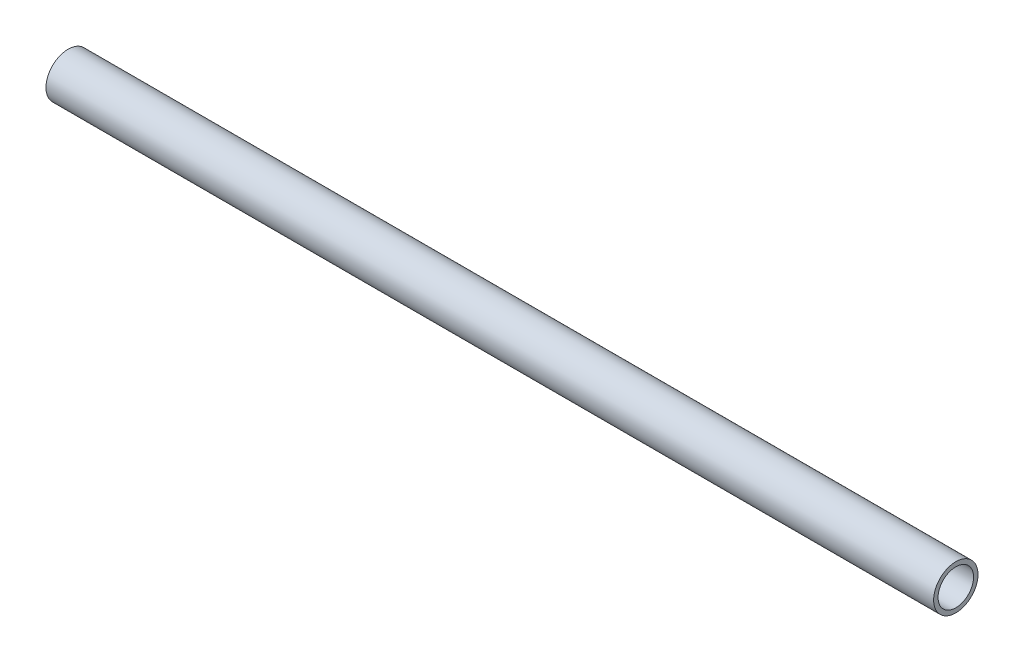
ISO-10303-21;
HEADER;
FILE_DESCRIPTION(('STEP AP214'),'2;1');
FILE_NAME('part.step','',(''),(''),'','','');
FILE_SCHEMA(('AUTOMOTIVE_DESIGN { 1 0 10303 214 1 1 1 1 }'));
ENDSEC;
DATA;
#1=APPLICATION_CONTEXT('core data for automotive mechanical design processes');
#2=APPLICATION_PROTOCOL_DEFINITION('international standard','automotive_design',2000,#1);
#3=PRODUCT_CONTEXT('',#1,'mechanical');
#4=PRODUCT('Part','Part','',(#3));
#5=PRODUCT_RELATED_PRODUCT_CATEGORY('part','',(#4));
#6=PRODUCT_DEFINITION_FORMATION('','',#4);
#7=PRODUCT_DEFINITION_CONTEXT('part definition',#1,'design');
#8=PRODUCT_DEFINITION('design','',#6,#7);
#9=PRODUCT_DEFINITION_SHAPE('','',#8);
#10=(LENGTH_UNIT() NAMED_UNIT(*) SI_UNIT(.MILLI.,.METRE.));
#11=(NAMED_UNIT(*) PLANE_ANGLE_UNIT() SI_UNIT($,.RADIAN.));
#12=(NAMED_UNIT(*) SI_UNIT($,.STERADIAN.) SOLID_ANGLE_UNIT());
#13=UNCERTAINTY_MEASURE_WITH_UNIT(LENGTH_MEASURE(1.E-05),#10,'distance_accuracy_value','');
#14=(GEOMETRIC_REPRESENTATION_CONTEXT(3) GLOBAL_UNCERTAINTY_ASSIGNED_CONTEXT((#13)) GLOBAL_UNIT_ASSIGNED_CONTEXT((#10,
#11,#12)) REPRESENTATION_CONTEXT('',''));
#15=CARTESIAN_POINT('',(0.,0.,0.));
#16=DIRECTION('',(0.,0.,1.));
#17=DIRECTION('',(1.,0.,0.));
#18=AXIS2_PLACEMENT_3D('',#15,#16,#17);
#19=CARTESIAN_POINT('',(100.,0.,0.));
#20=DIRECTION('',(1.,0.,0.));
#21=DIRECTION('',(0.,0.,-1.));
#22=AXIS2_PLACEMENT_3D('',#19,#20,#21);
#23=PLANE('',#22);
#24=CARTESIAN_POINT('',(100.,0.,0.));
#25=DIRECTION('',(1.,0.,0.));
#26=DIRECTION('',(0.,0.,-1.));
#27=AXIS2_PLACEMENT_3D('',#24,#25,#26);
#28=CIRCLE('',#27,5.);
#29=CARTESIAN_POINT('',(100.,0.,-5.));
#30=VERTEX_POINT('',#29);
#31=EDGE_CURVE('E10',#30,#30,#28,.T.);
#32=ORIENTED_EDGE('',*,*,#31,.T.);
#33=EDGE_LOOP('',(#32));
#34=FACE_BOUND('',#33,.T.);
#35=CARTESIAN_POINT('',(100.,0.,0.));
#36=DIRECTION('',(1.,0.,0.));
#37=DIRECTION('',(0.,0.,-1.));
#38=AXIS2_PLACEMENT_3D('',#35,#36,#37);
#39=CIRCLE('',#38,4.);
#40=CARTESIAN_POINT('',(100.,0.,-4.));
#41=VERTEX_POINT('',#40);
#42=EDGE_CURVE('E50',#41,#41,#39,.T.);
#43=ORIENTED_EDGE('',*,*,#42,.F.);
#44=EDGE_LOOP('',(#43));
#45=FACE_BOUND('',#44,.T.);
#46=ADVANCED_FACE('F37',(#34,#45),#23,.T.);
#47=CARTESIAN_POINT('',(-100.,0.,0.));
#48=DIRECTION('',(1.,0.,0.));
#49=DIRECTION('',(0.,0.,-1.));
#50=AXIS2_PLACEMENT_3D('',#47,#48,#49);
#51=PLANE('',#50);
#52=CARTESIAN_POINT('',(-100.,0.,0.));
#53=DIRECTION('',(1.,0.,0.));
#54=DIRECTION('',(0.,0.,-1.));
#55=AXIS2_PLACEMENT_3D('',#52,#53,#54);
#56=CIRCLE('',#55,5.);
#57=CARTESIAN_POINT('',(-100.,0.,-5.));
#58=VERTEX_POINT('',#57);
#59=EDGE_CURVE('E41',#58,#58,#56,.T.);
#60=ORIENTED_EDGE('',*,*,#59,.F.);
#61=EDGE_LOOP('',(#60));
#62=FACE_BOUND('',#61,.T.);
#63=CARTESIAN_POINT('',(-100.,0.,0.));
#64=DIRECTION('',(1.,0.,0.));
#65=DIRECTION('',(0.,0.,-1.));
#66=AXIS2_PLACEMENT_3D('',#63,#64,#65);
#67=CIRCLE('',#66,4.);
#68=CARTESIAN_POINT('',(-100.,0.,-4.));
#69=VERTEX_POINT('',#68);
#70=EDGE_CURVE('E52',#69,#69,#67,.T.);
#71=ORIENTED_EDGE('',*,*,#70,.T.);
#72=EDGE_LOOP('',(#71));
#73=FACE_BOUND('',#72,.T.);
#74=ADVANCED_FACE('F64',(#62,#73),#51,.F.);
#75=CARTESIAN_POINT('',(100.,0.,0.));
#76=DIRECTION('',(-1.,0.,0.));
#77=DIRECTION('',(0.,0.,1.));
#78=AXIS2_PLACEMENT_3D('',#75,#76,#77);
#79=CYLINDRICAL_SURFACE('',#78,5.);
#80=ORIENTED_EDGE('',*,*,#31,.F.);
#81=EDGE_LOOP('',(#80));
#82=FACE_BOUND('',#81,.T.);
#83=ORIENTED_EDGE('',*,*,#59,.T.);
#84=EDGE_LOOP('',(#83));
#85=FACE_BOUND('',#84,.T.);
#86=ADVANCED_FACE('F39',(#82,#85),#79,.T.);
#87=CARTESIAN_POINT('',(100.,0.,0.));
#88=DIRECTION('',(-1.,0.,0.));
#89=DIRECTION('',(0.,0.,1.));
#90=AXIS2_PLACEMENT_3D('',#87,#88,#89);
#91=CYLINDRICAL_SURFACE('',#90,4.);
#92=ORIENTED_EDGE('',*,*,#42,.T.);
#93=EDGE_LOOP('',(#92));
#94=FACE_BOUND('',#93,.T.);
#95=ORIENTED_EDGE('',*,*,#70,.F.);
#96=EDGE_LOOP('',(#95));
#97=FACE_BOUND('',#96,.T.);
#98=ADVANCED_FACE('F60',(#94,#97),#91,.F.);
#99=CLOSED_SHELL('',(#46,#74,#86,#98));
#100=MANIFOLD_SOLID_BREP('B2',#99);
#101=ADVANCED_BREP_SHAPE_REPRESENTATION('',(#18,#100),#14);
#102=SHAPE_DEFINITION_REPRESENTATION(#9,#101);
ENDSEC;
END-ISO-10303-21;
